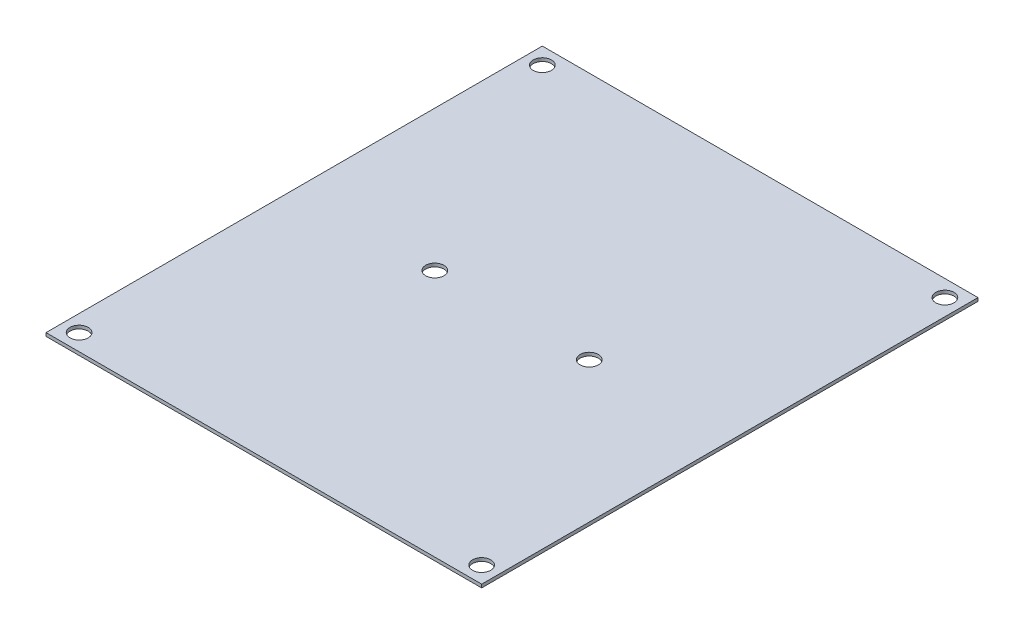
ISO-10303-21;
HEADER;
FILE_DESCRIPTION(('STEP AP214'),'2;1');
FILE_NAME('part.step','',(''),(''),'','','');
FILE_SCHEMA(('AUTOMOTIVE_DESIGN { 1 0 10303 214 1 1 1 1 }'));
ENDSEC;
DATA;
#1=APPLICATION_CONTEXT('core data for automotive mechanical design processes');
#2=APPLICATION_PROTOCOL_DEFINITION('international standard','automotive_design',2000,#1);
#3=PRODUCT_CONTEXT('',#1,'mechanical');
#4=PRODUCT('Part','Part','',(#3));
#5=PRODUCT_RELATED_PRODUCT_CATEGORY('part','',(#4));
#6=PRODUCT_DEFINITION_FORMATION('','',#4);
#7=PRODUCT_DEFINITION_CONTEXT('part definition',#1,'design');
#8=PRODUCT_DEFINITION('design','',#6,#7);
#9=PRODUCT_DEFINITION_SHAPE('','',#8);
#10=(LENGTH_UNIT() NAMED_UNIT(*) SI_UNIT(.MILLI.,.METRE.));
#11=(NAMED_UNIT(*) PLANE_ANGLE_UNIT() SI_UNIT($,.RADIAN.));
#12=(NAMED_UNIT(*) SI_UNIT($,.STERADIAN.) SOLID_ANGLE_UNIT());
#13=UNCERTAINTY_MEASURE_WITH_UNIT(LENGTH_MEASURE(1.E-05),#10,'distance_accuracy_value','');
#14=(GEOMETRIC_REPRESENTATION_CONTEXT(3) GLOBAL_UNCERTAINTY_ASSIGNED_CONTEXT((#13)) GLOBAL_UNIT_ASSIGNED_CONTEXT((#10,
#11,#12)) REPRESENTATION_CONTEXT('',''));
#15=CARTESIAN_POINT('',(0.,0.,0.));
#16=DIRECTION('',(0.,0.,1.));
#17=DIRECTION('',(1.,0.,0.));
#18=AXIS2_PLACEMENT_3D('',#15,#16,#17);
#19=CARTESIAN_POINT('',(0.,0.6,0.));
#20=DIRECTION('',(1.,0.,0.));
#21=DIRECTION('',(0.,0.,-1.));
#22=AXIS2_PLACEMENT_3D('',#19,#20,#21);
#23=PLANE('',#22);
#24=DIRECTION('',(0.,0.,1.));
#25=VECTOR('',#24,1.);
#26=CARTESIAN_POINT('',(0.,0.,0.));
#27=LINE('',#26,#25);
#28=CARTESIAN_POINT('',(0.,0.,-90.));
#29=VERTEX_POINT('',#28);
#30=CARTESIAN_POINT('',(0.,0.,0.));
#31=VERTEX_POINT('',#30);
#32=EDGE_CURVE('E97',#29,#31,#27,.T.);
#33=ORIENTED_EDGE('',*,*,#32,.T.);
#34=DIRECTION('',(0.,-1.,0.));
#35=VECTOR('',#34,1.);
#36=CARTESIAN_POINT('',(0.,0.6,0.));
#37=LINE('',#36,#35);
#38=CARTESIAN_POINT('',(0.,0.6,0.));
#39=VERTEX_POINT('',#38);
#40=EDGE_CURVE('E11',#39,#31,#37,.T.);
#41=ORIENTED_EDGE('',*,*,#40,.F.);
#42=DIRECTION('',(0.,0.,1.));
#43=VECTOR('',#42,1.);
#44=CARTESIAN_POINT('',(0.,0.6,0.));
#45=LINE('',#44,#43);
#46=CARTESIAN_POINT('',(0.,0.6,-90.));
#47=VERTEX_POINT('',#46);
#48=EDGE_CURVE('E85',#47,#39,#45,.T.);
#49=ORIENTED_EDGE('',*,*,#48,.F.);
#50=DIRECTION('',(0.,-1.,0.));
#51=VECTOR('',#50,1.);
#52=CARTESIAN_POINT('',(0.,0.6,-90.));
#53=LINE('',#52,#51);
#54=EDGE_CURVE('E93',#47,#29,#53,.T.);
#55=ORIENTED_EDGE('',*,*,#54,.T.);
#56=EDGE_LOOP('',(#33,#41,#49,#55));
#57=FACE_BOUND('',#56,.T.);
#58=ADVANCED_FACE('F34',(#57),#23,.F.);
#59=CARTESIAN_POINT('',(0.,0.6,0.));
#60=DIRECTION('',(0.,0.,-1.));
#61=DIRECTION('',(-1.,0.,0.));
#62=AXIS2_PLACEMENT_3D('',#59,#60,#61);
#63=PLANE('',#62);
#64=DIRECTION('',(1.,0.,0.));
#65=VECTOR('',#64,1.);
#66=CARTESIAN_POINT('',(0.,0.,0.));
#67=LINE('',#66,#65);
#68=CARTESIAN_POINT('',(79.,0.,0.));
#69=VERTEX_POINT('',#68);
#70=EDGE_CURVE('E89',#31,#69,#67,.T.);
#71=ORIENTED_EDGE('',*,*,#70,.T.);
#72=DIRECTION('',(0.,-1.,0.));
#73=VECTOR('',#72,1.);
#74=CARTESIAN_POINT('',(79.,0.6,0.));
#75=LINE('',#74,#73);
#76=CARTESIAN_POINT('',(79.,0.6,0.));
#77=VERTEX_POINT('',#76);
#78=EDGE_CURVE('E42',#77,#69,#75,.T.);
#79=ORIENTED_EDGE('',*,*,#78,.F.);
#80=DIRECTION('',(1.,0.,0.));
#81=VECTOR('',#80,1.);
#82=CARTESIAN_POINT('',(0.,0.6,0.));
#83=LINE('',#82,#81);
#84=EDGE_CURVE('E80',#39,#77,#83,.T.);
#85=ORIENTED_EDGE('',*,*,#84,.F.);
#86=ORIENTED_EDGE('',*,*,#40,.T.);
#87=EDGE_LOOP('',(#71,#79,#85,#86));
#88=FACE_BOUND('',#87,.T.);
#89=ADVANCED_FACE('F88',(#88),#63,.F.);
#90=CARTESIAN_POINT('',(79.,0.6,0.));
#91=DIRECTION('',(-1.,0.,0.));
#92=DIRECTION('',(0.,0.,1.));
#93=AXIS2_PLACEMENT_3D('',#90,#91,#92);
#94=PLANE('',#93);
#95=DIRECTION('',(0.,0.,-1.));
#96=VECTOR('',#95,1.);
#97=CARTESIAN_POINT('',(79.,0.,0.));
#98=LINE('',#97,#96);
#99=CARTESIAN_POINT('',(79.,0.,-90.));
#100=VERTEX_POINT('',#99);
#101=EDGE_CURVE('E67',#69,#100,#98,.T.);
#102=ORIENTED_EDGE('',*,*,#101,.T.);
#103=DIRECTION('',(0.,-1.,0.));
#104=VECTOR('',#103,1.);
#105=CARTESIAN_POINT('',(79.,0.6,-90.));
#106=LINE('',#105,#104);
#107=CARTESIAN_POINT('',(79.,0.6,-90.));
#108=VERTEX_POINT('',#107);
#109=EDGE_CURVE('E90',#108,#100,#106,.T.);
#110=ORIENTED_EDGE('',*,*,#109,.F.);
#111=DIRECTION('',(0.,0.,-1.));
#112=VECTOR('',#111,1.);
#113=CARTESIAN_POINT('',(79.,0.6,0.));
#114=LINE('',#113,#112);
#115=EDGE_CURVE('E83',#77,#108,#114,.T.);
#116=ORIENTED_EDGE('',*,*,#115,.F.);
#117=ORIENTED_EDGE('',*,*,#78,.T.);
#118=EDGE_LOOP('',(#102,#110,#116,#117));
#119=FACE_BOUND('',#118,.T.);
#120=ADVANCED_FACE('F91',(#119),#94,.F.);
#121=CARTESIAN_POINT('',(0.,0.6,-90.));
#122=DIRECTION('',(0.,0.,1.));
#123=DIRECTION('',(1.,0.,0.));
#124=AXIS2_PLACEMENT_3D('',#121,#122,#123);
#125=PLANE('',#124);
#126=DIRECTION('',(-1.,0.,0.));
#127=VECTOR('',#126,1.);
#128=CARTESIAN_POINT('',(0.,0.,-90.));
#129=LINE('',#128,#127);
#130=EDGE_CURVE('E73',#100,#29,#129,.T.);
#131=ORIENTED_EDGE('',*,*,#130,.T.);
#132=ORIENTED_EDGE('',*,*,#54,.F.);
#133=DIRECTION('',(-1.,0.,0.));
#134=VECTOR('',#133,1.);
#135=CARTESIAN_POINT('',(0.,0.6,-90.));
#136=LINE('',#135,#134);
#137=EDGE_CURVE('E50',#108,#47,#136,.T.);
#138=ORIENTED_EDGE('',*,*,#137,.F.);
#139=ORIENTED_EDGE('',*,*,#109,.T.);
#140=EDGE_LOOP('',(#131,#132,#138,#139));
#141=FACE_BOUND('',#140,.T.);
#142=ADVANCED_FACE('F105',(#141),#125,.F.);
#143=CARTESIAN_POINT('',(0.,0.6,0.));
#144=DIRECTION('',(0.,-1.,0.));
#145=DIRECTION('',(0.,0.,-1.));
#146=AXIS2_PLACEMENT_3D('',#143,#144,#145);
#147=PLANE('',#146);
#148=CARTESIAN_POINT('',(3.,0.6,-3.00000000000001));
#149=DIRECTION('',(0.,1.,0.));
#150=DIRECTION('',(0.,0.,1.));
#151=AXIS2_PLACEMENT_3D('',#148,#149,#150);
#152=CIRCLE('',#151,1.65);
#153=CARTESIAN_POINT('',(3.,0.6,-1.35000000000001));
#154=VERTEX_POINT('',#153);
#155=EDGE_CURVE('E117',#154,#154,#152,.T.);
#156=ORIENTED_EDGE('',*,*,#155,.F.);
#157=EDGE_LOOP('',(#156));
#158=FACE_BOUND('',#157,.T.);
#159=CARTESIAN_POINT('',(76.,0.6,-87.));
#160=DIRECTION('',(0.,1.,0.));
#161=DIRECTION('',(0.,0.,1.));
#162=AXIS2_PLACEMENT_3D('',#159,#160,#161);
#163=CIRCLE('',#162,1.65);
#164=CARTESIAN_POINT('',(76.,0.6,-85.35));
#165=VERTEX_POINT('',#164);
#166=EDGE_CURVE('E131',#165,#165,#163,.T.);
#167=ORIENTED_EDGE('',*,*,#166,.F.);
#168=EDGE_LOOP('',(#167));
#169=FACE_BOUND('',#168,.T.);
#170=CARTESIAN_POINT('',(53.5,0.6,-45.));
#171=DIRECTION('',(0.,1.,0.));
#172=DIRECTION('',(0.,0.,1.));
#173=AXIS2_PLACEMENT_3D('',#170,#171,#172);
#174=CIRCLE('',#173,1.65);
#175=CARTESIAN_POINT('',(53.5,0.6,-43.35));
#176=VERTEX_POINT('',#175);
#177=EDGE_CURVE('E124',#176,#176,#174,.T.);
#178=ORIENTED_EDGE('',*,*,#177,.F.);
#179=EDGE_LOOP('',(#178));
#180=FACE_BOUND('',#179,.T.);
#181=CARTESIAN_POINT('',(25.5,0.6,-45.));
#182=DIRECTION('',(0.,1.,0.));
#183=DIRECTION('',(0.,0.,1.));
#184=AXIS2_PLACEMENT_3D('',#181,#182,#183);
#185=CIRCLE('',#184,1.65);
#186=CARTESIAN_POINT('',(25.5,0.6,-43.35));
#187=VERTEX_POINT('',#186);
#188=EDGE_CURVE('E141',#187,#187,#185,.T.);
#189=ORIENTED_EDGE('',*,*,#188,.F.);
#190=EDGE_LOOP('',(#189));
#191=FACE_BOUND('',#190,.T.);
#192=CARTESIAN_POINT('',(76.,0.6,-3.00000000000002));
#193=DIRECTION('',(0.,1.,0.));
#194=DIRECTION('',(0.,0.,1.));
#195=AXIS2_PLACEMENT_3D('',#192,#193,#194);
#196=CIRCLE('',#195,1.65);
#197=CARTESIAN_POINT('',(76.,0.6,-1.35000000000001));
#198=VERTEX_POINT('',#197);
#199=EDGE_CURVE('E123',#198,#198,#196,.T.);
#200=ORIENTED_EDGE('',*,*,#199,.F.);
#201=EDGE_LOOP('',(#200));
#202=FACE_BOUND('',#201,.T.);
#203=CARTESIAN_POINT('',(3.,0.6,-87.));
#204=DIRECTION('',(0.,1.,0.));
#205=DIRECTION('',(0.,0.,1.));
#206=AXIS2_PLACEMENT_3D('',#203,#204,#205);
#207=CIRCLE('',#206,1.65);
#208=CARTESIAN_POINT('',(3.,0.6,-85.35));
#209=VERTEX_POINT('',#208);
#210=EDGE_CURVE('E111',#209,#209,#207,.T.);
#211=ORIENTED_EDGE('',*,*,#210,.F.);
#212=EDGE_LOOP('',(#211));
#213=FACE_BOUND('',#212,.T.);
#214=ORIENTED_EDGE('',*,*,#48,.T.);
#215=ORIENTED_EDGE('',*,*,#84,.T.);
#216=ORIENTED_EDGE('',*,*,#115,.T.);
#217=ORIENTED_EDGE('',*,*,#137,.T.);
#218=EDGE_LOOP('',(#214,#215,#216,#217));
#219=FACE_BOUND('',#218,.T.);
#220=ADVANCED_FACE('F81',(#158,#169,#180,#191,#202,#213,#219),#147,.F.);
#221=CARTESIAN_POINT('',(0.,0.,0.));
#222=DIRECTION('',(0.,-1.,0.));
#223=DIRECTION('',(0.,0.,-1.));
#224=AXIS2_PLACEMENT_3D('',#221,#222,#223);
#225=PLANE('',#224);
#226=CARTESIAN_POINT('',(3.,0.,-3.00000000000001));
#227=DIRECTION('',(0.,1.,0.));
#228=DIRECTION('',(0.,0.,1.));
#229=AXIS2_PLACEMENT_3D('',#226,#227,#228);
#230=CIRCLE('',#229,1.65);
#231=CARTESIAN_POINT('',(3.,0.,-1.35000000000001));
#232=VERTEX_POINT('',#231);
#233=EDGE_CURVE('E120',#232,#232,#230,.T.);
#234=ORIENTED_EDGE('',*,*,#233,.T.);
#235=EDGE_LOOP('',(#234));
#236=FACE_BOUND('',#235,.T.);
#237=CARTESIAN_POINT('',(76.,0.,-87.));
#238=DIRECTION('',(0.,1.,0.));
#239=DIRECTION('',(0.,0.,1.));
#240=AXIS2_PLACEMENT_3D('',#237,#238,#239);
#241=CIRCLE('',#240,1.65);
#242=CARTESIAN_POINT('',(76.,0.,-85.35));
#243=VERTEX_POINT('',#242);
#244=EDGE_CURVE('E114',#243,#243,#241,.T.);
#245=ORIENTED_EDGE('',*,*,#244,.T.);
#246=EDGE_LOOP('',(#245));
#247=FACE_BOUND('',#246,.T.);
#248=CARTESIAN_POINT('',(53.5,0.,-45.));
#249=DIRECTION('',(0.,1.,0.));
#250=DIRECTION('',(0.,0.,1.));
#251=AXIS2_PLACEMENT_3D('',#248,#249,#250);
#252=CIRCLE('',#251,1.65);
#253=CARTESIAN_POINT('',(53.5,0.,-43.35));
#254=VERTEX_POINT('',#253);
#255=EDGE_CURVE('E127',#254,#254,#252,.T.);
#256=ORIENTED_EDGE('',*,*,#255,.T.);
#257=EDGE_LOOP('',(#256));
#258=FACE_BOUND('',#257,.T.);
#259=CARTESIAN_POINT('',(25.5,0.,-45.));
#260=DIRECTION('',(0.,1.,0.));
#261=DIRECTION('',(0.,0.,1.));
#262=AXIS2_PLACEMENT_3D('',#259,#260,#261);
#263=CIRCLE('',#262,1.65);
#264=CARTESIAN_POINT('',(25.5,0.,-43.35));
#265=VERTEX_POINT('',#264);
#266=EDGE_CURVE('E128',#265,#265,#263,.T.);
#267=ORIENTED_EDGE('',*,*,#266,.T.);
#268=EDGE_LOOP('',(#267));
#269=FACE_BOUND('',#268,.T.);
#270=CARTESIAN_POINT('',(76.,0.,-3.00000000000002));
#271=DIRECTION('',(0.,1.,0.));
#272=DIRECTION('',(0.,0.,1.));
#273=AXIS2_PLACEMENT_3D('',#270,#271,#272);
#274=CIRCLE('',#273,1.65);
#275=CARTESIAN_POINT('',(76.,0.,-1.35000000000001));
#276=VERTEX_POINT('',#275);
#277=EDGE_CURVE('E138',#276,#276,#274,.T.);
#278=ORIENTED_EDGE('',*,*,#277,.T.);
#279=EDGE_LOOP('',(#278));
#280=FACE_BOUND('',#279,.T.);
#281=CARTESIAN_POINT('',(3.,0.,-87.));
#282=DIRECTION('',(0.,1.,0.));
#283=DIRECTION('',(0.,0.,1.));
#284=AXIS2_PLACEMENT_3D('',#281,#282,#283);
#285=CIRCLE('',#284,1.65);
#286=CARTESIAN_POINT('',(3.,0.,-85.35));
#287=VERTEX_POINT('',#286);
#288=EDGE_CURVE('E100',#287,#287,#285,.T.);
#289=ORIENTED_EDGE('',*,*,#288,.T.);
#290=EDGE_LOOP('',(#289));
#291=FACE_BOUND('',#290,.T.);
#292=ORIENTED_EDGE('',*,*,#32,.F.);
#293=ORIENTED_EDGE('',*,*,#130,.F.);
#294=ORIENTED_EDGE('',*,*,#101,.F.);
#295=ORIENTED_EDGE('',*,*,#70,.F.);
#296=EDGE_LOOP('',(#292,#293,#294,#295));
#297=FACE_BOUND('',#296,.T.);
#298=ADVANCED_FACE('F108',(#236,#247,#258,#269,#280,#291,#297),#225,.T.);
#299=CARTESIAN_POINT('',(3.,0.,-87.));
#300=DIRECTION('',(0.,1.,0.));
#301=DIRECTION('',(0.,0.,1.));
#302=AXIS2_PLACEMENT_3D('',#299,#300,#301);
#303=CYLINDRICAL_SURFACE('',#302,1.65);
#304=ORIENTED_EDGE('',*,*,#288,.F.);
#305=EDGE_LOOP('',(#304));
#306=FACE_BOUND('',#305,.T.);
#307=ORIENTED_EDGE('',*,*,#210,.T.);
#308=EDGE_LOOP('',(#307));
#309=FACE_BOUND('',#308,.T.);
#310=ADVANCED_FACE('F165',(#306,#309),#303,.F.);
#311=CARTESIAN_POINT('',(76.,0.,-3.00000000000002));
#312=DIRECTION('',(0.,1.,0.));
#313=DIRECTION('',(0.,0.,1.));
#314=AXIS2_PLACEMENT_3D('',#311,#312,#313);
#315=CYLINDRICAL_SURFACE('',#314,1.65);
#316=ORIENTED_EDGE('',*,*,#277,.F.);
#317=EDGE_LOOP('',(#316));
#318=FACE_BOUND('',#317,.T.);
#319=ORIENTED_EDGE('',*,*,#199,.T.);
#320=EDGE_LOOP('',(#319));
#321=FACE_BOUND('',#320,.T.);
#322=ADVANCED_FACE('F153',(#318,#321),#315,.F.);
#323=CARTESIAN_POINT('',(25.5,0.,-45.));
#324=DIRECTION('',(0.,1.,0.));
#325=DIRECTION('',(0.,0.,1.));
#326=AXIS2_PLACEMENT_3D('',#323,#324,#325);
#327=CYLINDRICAL_SURFACE('',#326,1.65);
#328=ORIENTED_EDGE('',*,*,#266,.F.);
#329=EDGE_LOOP('',(#328));
#330=FACE_BOUND('',#329,.T.);
#331=ORIENTED_EDGE('',*,*,#188,.T.);
#332=EDGE_LOOP('',(#331));
#333=FACE_BOUND('',#332,.T.);
#334=ADVANCED_FACE('F149',(#330,#333),#327,.F.);
#335=CARTESIAN_POINT('',(53.5,0.,-45.));
#336=DIRECTION('',(0.,1.,0.));
#337=DIRECTION('',(0.,0.,1.));
#338=AXIS2_PLACEMENT_3D('',#335,#336,#337);
#339=CYLINDRICAL_SURFACE('',#338,1.65);
#340=ORIENTED_EDGE('',*,*,#255,.F.);
#341=EDGE_LOOP('',(#340));
#342=FACE_BOUND('',#341,.T.);
#343=ORIENTED_EDGE('',*,*,#177,.T.);
#344=EDGE_LOOP('',(#343));
#345=FACE_BOUND('',#344,.T.);
#346=ADVANCED_FACE('F152',(#342,#345),#339,.F.);
#347=CARTESIAN_POINT('',(76.,0.,-87.));
#348=DIRECTION('',(0.,1.,0.));
#349=DIRECTION('',(0.,0.,1.));
#350=AXIS2_PLACEMENT_3D('',#347,#348,#349);
#351=CYLINDRICAL_SURFACE('',#350,1.65);
#352=ORIENTED_EDGE('',*,*,#244,.F.);
#353=EDGE_LOOP('',(#352));
#354=FACE_BOUND('',#353,.T.);
#355=ORIENTED_EDGE('',*,*,#166,.T.);
#356=EDGE_LOOP('',(#355));
#357=FACE_BOUND('',#356,.T.);
#358=ADVANCED_FACE('F226',(#354,#357),#351,.F.);
#359=CARTESIAN_POINT('',(3.,0.,-3.00000000000001));
#360=DIRECTION('',(0.,1.,0.));
#361=DIRECTION('',(0.,0.,1.));
#362=AXIS2_PLACEMENT_3D('',#359,#360,#361);
#363=CYLINDRICAL_SURFACE('',#362,1.65);
#364=ORIENTED_EDGE('',*,*,#233,.F.);
#365=EDGE_LOOP('',(#364));
#366=FACE_BOUND('',#365,.T.);
#367=ORIENTED_EDGE('',*,*,#155,.T.);
#368=EDGE_LOOP('',(#367));
#369=FACE_BOUND('',#368,.T.);
#370=ADVANCED_FACE('F236',(#366,#369),#363,.F.);
#371=CLOSED_SHELL('',(#58,#89,#120,#142,#220,#298,#310,#322,#334,#346,#358,#370));
#372=MANIFOLD_SOLID_BREP('B2',#371);
#373=ADVANCED_BREP_SHAPE_REPRESENTATION('',(#18,#372),#14);
#374=SHAPE_DEFINITION_REPRESENTATION(#9,#373);
ENDSEC;
END-ISO-10303-21;
